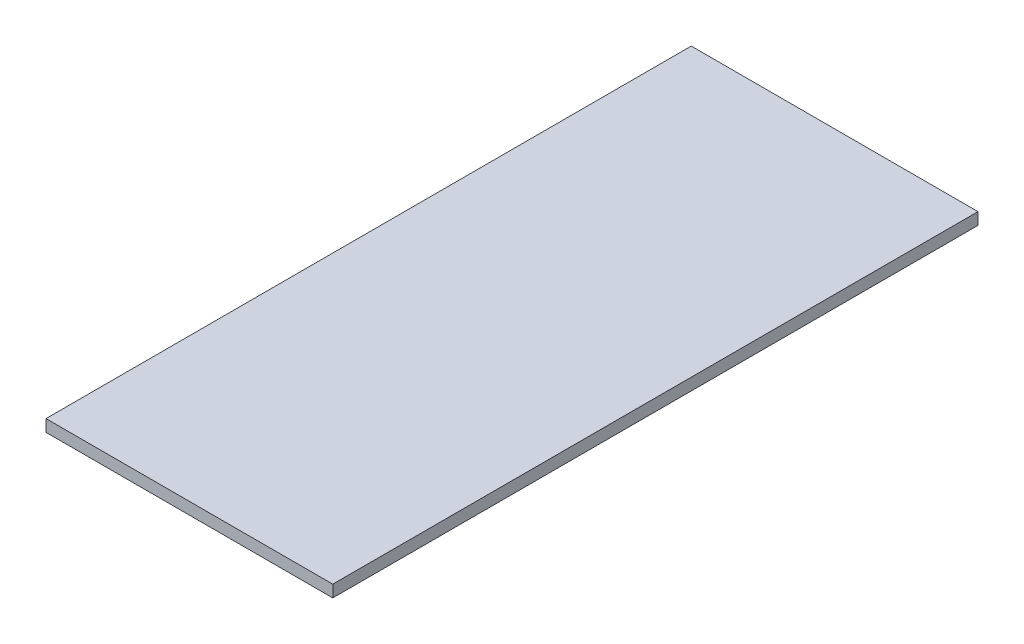
ISO-10303-21;
HEADER;
FILE_DESCRIPTION(('STEP AP214'),'2;1');
FILE_NAME('part.step','',(''),(''),'','','');
FILE_SCHEMA(('AUTOMOTIVE_DESIGN { 1 0 10303 214 1 1 1 1 }'));
ENDSEC;
DATA;
#1=APPLICATION_CONTEXT('core data for automotive mechanical design processes');
#2=APPLICATION_PROTOCOL_DEFINITION('international standard','automotive_design',2000,#1);
#3=PRODUCT_CONTEXT('',#1,'mechanical');
#4=PRODUCT('Part','Part','',(#3));
#5=PRODUCT_RELATED_PRODUCT_CATEGORY('part','',(#4));
#6=PRODUCT_DEFINITION_FORMATION('','',#4);
#7=PRODUCT_DEFINITION_CONTEXT('part definition',#1,'design');
#8=PRODUCT_DEFINITION('design','',#6,#7);
#9=PRODUCT_DEFINITION_SHAPE('','',#8);
#10=(LENGTH_UNIT() NAMED_UNIT(*) SI_UNIT(.MILLI.,.METRE.));
#11=(NAMED_UNIT(*) PLANE_ANGLE_UNIT() SI_UNIT($,.RADIAN.));
#12=(NAMED_UNIT(*) SI_UNIT($,.STERADIAN.) SOLID_ANGLE_UNIT());
#13=UNCERTAINTY_MEASURE_WITH_UNIT(LENGTH_MEASURE(1.E-05),#10,'distance_accuracy_value','');
#14=(GEOMETRIC_REPRESENTATION_CONTEXT(3) GLOBAL_UNCERTAINTY_ASSIGNED_CONTEXT((#13)) GLOBAL_UNIT_ASSIGNED_CONTEXT((#10,
#11,#12)) REPRESENTATION_CONTEXT('',''));
#15=CARTESIAN_POINT('',(0.,0.,0.));
#16=DIRECTION('',(0.,0.,1.));
#17=DIRECTION('',(1.,0.,0.));
#18=AXIS2_PLACEMENT_3D('',#15,#16,#17);
#19=CARTESIAN_POINT('',(0.,5.,0.));
#20=DIRECTION('',(1.,0.,0.));
#21=DIRECTION('',(0.,0.,-1.));
#22=AXIS2_PLACEMENT_3D('',#19,#20,#21);
#23=PLANE('',#22);
#24=DIRECTION('',(0.,0.,1.));
#25=VECTOR('',#24,1.);
#26=CARTESIAN_POINT('',(0.,0.,0.));
#27=LINE('',#26,#25);
#28=CARTESIAN_POINT('',(0.,0.,-270.));
#29=VERTEX_POINT('',#28);
#30=CARTESIAN_POINT('',(0.,0.,0.));
#31=VERTEX_POINT('',#30);
#32=EDGE_CURVE('E96',#29,#31,#27,.T.);
#33=ORIENTED_EDGE('',*,*,#32,.T.);
#34=DIRECTION('',(0.,-1.,0.));
#35=VECTOR('',#34,1.);
#36=CARTESIAN_POINT('',(0.,5.,0.));
#37=LINE('',#36,#35);
#38=CARTESIAN_POINT('',(0.,5.,0.));
#39=VERTEX_POINT('',#38);
#40=EDGE_CURVE('E11',#39,#31,#37,.T.);
#41=ORIENTED_EDGE('',*,*,#40,.F.);
#42=DIRECTION('',(0.,0.,1.));
#43=VECTOR('',#42,1.);
#44=CARTESIAN_POINT('',(0.,5.,0.));
#45=LINE('',#44,#43);
#46=CARTESIAN_POINT('',(0.,5.,-270.));
#47=VERTEX_POINT('',#46);
#48=EDGE_CURVE('E84',#47,#39,#45,.T.);
#49=ORIENTED_EDGE('',*,*,#48,.F.);
#50=DIRECTION('',(0.,-1.,0.));
#51=VECTOR('',#50,1.);
#52=CARTESIAN_POINT('',(0.,5.,-270.));
#53=LINE('',#52,#51);
#54=EDGE_CURVE('E92',#47,#29,#53,.T.);
#55=ORIENTED_EDGE('',*,*,#54,.T.);
#56=EDGE_LOOP('',(#33,#41,#49,#55));
#57=FACE_BOUND('',#56,.T.);
#58=ADVANCED_FACE('F33',(#57),#23,.F.);
#59=CARTESIAN_POINT('',(0.,5.,0.));
#60=DIRECTION('',(0.,0.,-1.));
#61=DIRECTION('',(-1.,0.,0.));
#62=AXIS2_PLACEMENT_3D('',#59,#60,#61);
#63=PLANE('',#62);
#64=DIRECTION('',(1.,0.,0.));
#65=VECTOR('',#64,1.);
#66=CARTESIAN_POINT('',(0.,0.,0.));
#67=LINE('',#66,#65);
#68=CARTESIAN_POINT('',(120.,0.,0.));
#69=VERTEX_POINT('',#68);
#70=EDGE_CURVE('E88',#31,#69,#67,.T.);
#71=ORIENTED_EDGE('',*,*,#70,.T.);
#72=DIRECTION('',(0.,-1.,0.));
#73=VECTOR('',#72,1.);
#74=CARTESIAN_POINT('',(120.,5.,0.));
#75=LINE('',#74,#73);
#76=CARTESIAN_POINT('',(120.,5.,0.));
#77=VERTEX_POINT('',#76);
#78=EDGE_CURVE('E41',#77,#69,#75,.T.);
#79=ORIENTED_EDGE('',*,*,#78,.F.);
#80=DIRECTION('',(1.,0.,0.));
#81=VECTOR('',#80,1.);
#82=CARTESIAN_POINT('',(0.,5.,0.));
#83=LINE('',#82,#81);
#84=EDGE_CURVE('E79',#39,#77,#83,.T.);
#85=ORIENTED_EDGE('',*,*,#84,.F.);
#86=ORIENTED_EDGE('',*,*,#40,.T.);
#87=EDGE_LOOP('',(#71,#79,#85,#86));
#88=FACE_BOUND('',#87,.T.);
#89=ADVANCED_FACE('F87',(#88),#63,.F.);
#90=CARTESIAN_POINT('',(120.,5.,0.));
#91=DIRECTION('',(-1.,0.,0.));
#92=DIRECTION('',(0.,0.,1.));
#93=AXIS2_PLACEMENT_3D('',#90,#91,#92);
#94=PLANE('',#93);
#95=DIRECTION('',(0.,0.,-1.));
#96=VECTOR('',#95,1.);
#97=CARTESIAN_POINT('',(120.,0.,0.));
#98=LINE('',#97,#96);
#99=CARTESIAN_POINT('',(120.,0.,-270.));
#100=VERTEX_POINT('',#99);
#101=EDGE_CURVE('E66',#69,#100,#98,.T.);
#102=ORIENTED_EDGE('',*,*,#101,.T.);
#103=DIRECTION('',(0.,-1.,0.));
#104=VECTOR('',#103,1.);
#105=CARTESIAN_POINT('',(120.,5.,-270.));
#106=LINE('',#105,#104);
#107=CARTESIAN_POINT('',(120.,5.,-270.));
#108=VERTEX_POINT('',#107);
#109=EDGE_CURVE('E89',#108,#100,#106,.T.);
#110=ORIENTED_EDGE('',*,*,#109,.F.);
#111=DIRECTION('',(0.,0.,-1.));
#112=VECTOR('',#111,1.);
#113=CARTESIAN_POINT('',(120.,5.,0.));
#114=LINE('',#113,#112);
#115=EDGE_CURVE('E82',#77,#108,#114,.T.);
#116=ORIENTED_EDGE('',*,*,#115,.F.);
#117=ORIENTED_EDGE('',*,*,#78,.T.);
#118=EDGE_LOOP('',(#102,#110,#116,#117));
#119=FACE_BOUND('',#118,.T.);
#120=ADVANCED_FACE('F90',(#119),#94,.F.);
#121=CARTESIAN_POINT('',(0.,5.,-270.));
#122=DIRECTION('',(0.,0.,1.));
#123=DIRECTION('',(1.,0.,0.));
#124=AXIS2_PLACEMENT_3D('',#121,#122,#123);
#125=PLANE('',#124);
#126=DIRECTION('',(-1.,0.,0.));
#127=VECTOR('',#126,1.);
#128=CARTESIAN_POINT('',(0.,0.,-270.));
#129=LINE('',#128,#127);
#130=EDGE_CURVE('E72',#100,#29,#129,.T.);
#131=ORIENTED_EDGE('',*,*,#130,.T.);
#132=ORIENTED_EDGE('',*,*,#54,.F.);
#133=DIRECTION('',(-1.,0.,0.));
#134=VECTOR('',#133,1.);
#135=CARTESIAN_POINT('',(0.,5.,-270.));
#136=LINE('',#135,#134);
#137=EDGE_CURVE('E49',#108,#47,#136,.T.);
#138=ORIENTED_EDGE('',*,*,#137,.F.);
#139=ORIENTED_EDGE('',*,*,#109,.T.);
#140=EDGE_LOOP('',(#131,#132,#138,#139));
#141=FACE_BOUND('',#140,.T.);
#142=ADVANCED_FACE('F103',(#141),#125,.F.);
#143=CARTESIAN_POINT('',(0.,5.,0.));
#144=DIRECTION('',(0.,-1.,0.));
#145=DIRECTION('',(0.,0.,-1.));
#146=AXIS2_PLACEMENT_3D('',#143,#144,#145);
#147=PLANE('',#146);
#148=ORIENTED_EDGE('',*,*,#48,.T.);
#149=ORIENTED_EDGE('',*,*,#84,.T.);
#150=ORIENTED_EDGE('',*,*,#115,.T.);
#151=ORIENTED_EDGE('',*,*,#137,.T.);
#152=EDGE_LOOP('',(#148,#149,#150,#151));
#153=FACE_BOUND('',#152,.T.);
#154=ADVANCED_FACE('F80',(#153),#147,.F.);
#155=CARTESIAN_POINT('',(0.,0.,0.));
#156=DIRECTION('',(0.,-1.,0.));
#157=DIRECTION('',(0.,0.,-1.));
#158=AXIS2_PLACEMENT_3D('',#155,#156,#157);
#159=PLANE('',#158);
#160=ORIENTED_EDGE('',*,*,#32,.F.);
#161=ORIENTED_EDGE('',*,*,#130,.F.);
#162=ORIENTED_EDGE('',*,*,#101,.F.);
#163=ORIENTED_EDGE('',*,*,#70,.F.);
#164=EDGE_LOOP('',(#160,#161,#162,#163));
#165=FACE_BOUND('',#164,.T.);
#166=ADVANCED_FACE('F106',(#165),#159,.T.);
#167=CLOSED_SHELL('',(#58,#89,#120,#142,#154,#166));
#168=MANIFOLD_SOLID_BREP('B2',#167);
#169=ADVANCED_BREP_SHAPE_REPRESENTATION('',(#18,#168),#14);
#170=SHAPE_DEFINITION_REPRESENTATION(#9,#169);
ENDSEC;
END-ISO-10303-21;
